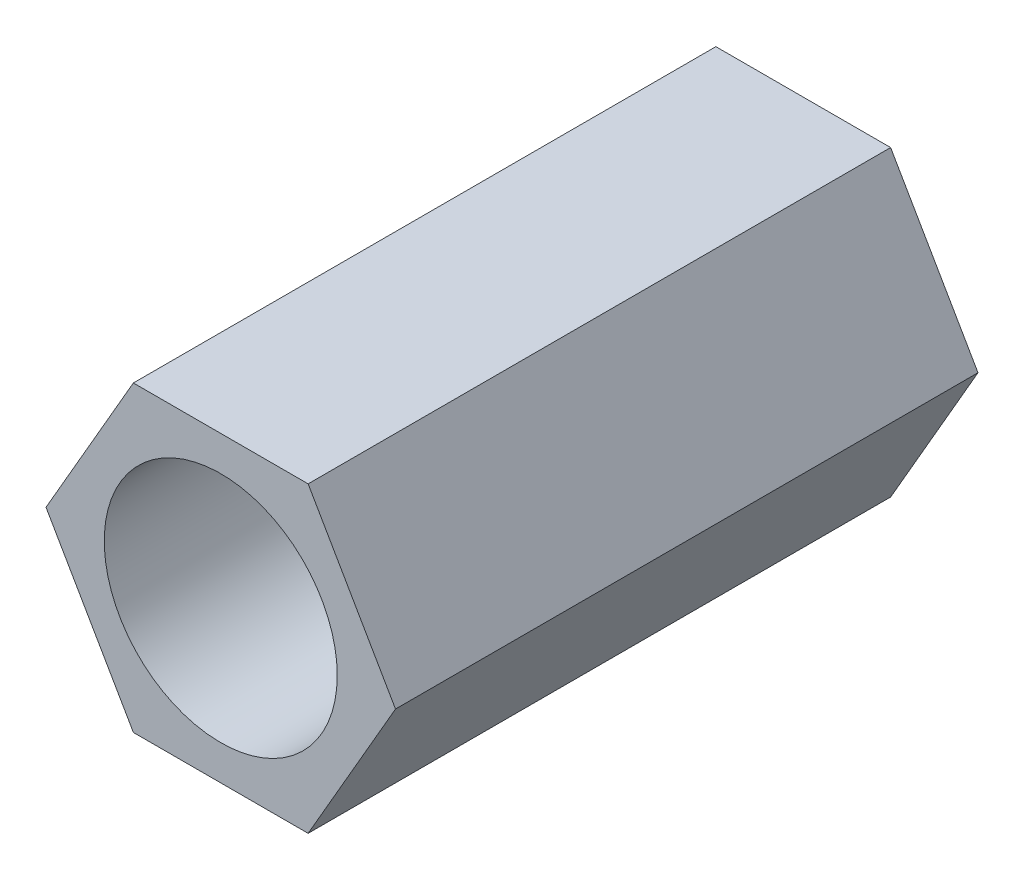
ISO-10303-21;
HEADER;
FILE_DESCRIPTION(('STEP AP214'),'2;1');
FILE_NAME('part.step','',(''),(''),'','','');
FILE_SCHEMA(('AUTOMOTIVE_DESIGN { 1 0 10303 214 1 1 1 1 }'));
ENDSEC;
DATA;
#1=APPLICATION_CONTEXT('core data for automotive mechanical design processes');
#2=APPLICATION_PROTOCOL_DEFINITION('international standard','automotive_design',2000,#1);
#3=PRODUCT_CONTEXT('',#1,'mechanical');
#4=PRODUCT('Part','Part','',(#3));
#5=PRODUCT_RELATED_PRODUCT_CATEGORY('part','',(#4));
#6=PRODUCT_DEFINITION_FORMATION('','',#4);
#7=PRODUCT_DEFINITION_CONTEXT('part definition',#1,'design');
#8=PRODUCT_DEFINITION('design','',#6,#7);
#9=PRODUCT_DEFINITION_SHAPE('','',#8);
#10=(LENGTH_UNIT() NAMED_UNIT(*) SI_UNIT(.MILLI.,.METRE.));
#11=(NAMED_UNIT(*) PLANE_ANGLE_UNIT() SI_UNIT($,.RADIAN.));
#12=(NAMED_UNIT(*) SI_UNIT($,.STERADIAN.) SOLID_ANGLE_UNIT());
#13=UNCERTAINTY_MEASURE_WITH_UNIT(LENGTH_MEASURE(1.E-05),#10,'distance_accuracy_value','');
#14=(GEOMETRIC_REPRESENTATION_CONTEXT(3) GLOBAL_UNCERTAINTY_ASSIGNED_CONTEXT((#13)) GLOBAL_UNIT_ASSIGNED_CONTEXT((#10,
#11,#12)) REPRESENTATION_CONTEXT('',''));
#15=CARTESIAN_POINT('',(0.,0.,0.));
#16=DIRECTION('',(0.,0.,1.));
#17=DIRECTION('',(1.,0.,0.));
#18=AXIS2_PLACEMENT_3D('',#15,#16,#17);
#19=CARTESIAN_POINT('',(0.,0.,10.));
#20=DIRECTION('',(0.,0.,1.));
#21=DIRECTION('',(1.,0.,0.));
#22=AXIS2_PLACEMENT_3D('',#19,#20,#21);
#23=PLANE('',#22);
#24=DIRECTION('',(-0.5,-0.866025403784439,0.));
#25=VECTOR('',#24,1.);
#26=CARTESIAN_POINT('',(-1.5,2.59807621135332,10.));
#27=LINE('',#26,#25);
#28=CARTESIAN_POINT('',(-1.5,2.59807621135332,10.));
#29=VERTEX_POINT('',#28);
#30=CARTESIAN_POINT('',(-3.,0.,10.));
#31=VERTEX_POINT('',#30);
#32=EDGE_CURVE('E146',#29,#31,#27,.T.);
#33=ORIENTED_EDGE('',*,*,#32,.T.);
#34=DIRECTION('',(0.5,-0.866025403784439,0.));
#35=VECTOR('',#34,1.);
#36=CARTESIAN_POINT('',(-3.,0.,10.));
#37=LINE('',#36,#35);
#38=CARTESIAN_POINT('',(-1.5,-2.59807621135332,10.));
#39=VERTEX_POINT('',#38);
#40=EDGE_CURVE('E94',#31,#39,#37,.T.);
#41=ORIENTED_EDGE('',*,*,#40,.T.);
#42=DIRECTION('',(1.,0.,0.));
#43=VECTOR('',#42,1.);
#44=CARTESIAN_POINT('',(-1.5,-2.59807621135332,10.));
#45=LINE('',#44,#43);
#46=CARTESIAN_POINT('',(1.5,-2.59807621135332,10.));
#47=VERTEX_POINT('',#46);
#48=EDGE_CURVE('E107',#39,#47,#45,.T.);
#49=ORIENTED_EDGE('',*,*,#48,.T.);
#50=DIRECTION('',(0.5,0.866025403784439,0.));
#51=VECTOR('',#50,1.);
#52=CARTESIAN_POINT('',(1.5,-2.59807621135332,10.));
#53=LINE('',#52,#51);
#54=CARTESIAN_POINT('',(3.,0.,10.));
#55=VERTEX_POINT('',#54);
#56=EDGE_CURVE('E101',#47,#55,#53,.T.);
#57=ORIENTED_EDGE('',*,*,#56,.T.);
#58=DIRECTION('',(-0.5,0.866025403784439,0.));
#59=VECTOR('',#58,1.);
#60=CARTESIAN_POINT('',(3.,0.,10.));
#61=LINE('',#60,#59);
#62=CARTESIAN_POINT('',(1.5,2.59807621135332,10.));
#63=VERTEX_POINT('',#62);
#64=EDGE_CURVE('E105',#55,#63,#61,.T.);
#65=ORIENTED_EDGE('',*,*,#64,.T.);
#66=DIRECTION('',(-1.,0.,0.));
#67=VECTOR('',#66,1.);
#68=CARTESIAN_POINT('',(1.5,2.59807621135332,10.));
#69=LINE('',#68,#67);
#70=EDGE_CURVE('E57',#63,#29,#69,.T.);
#71=ORIENTED_EDGE('',*,*,#70,.T.);
#72=EDGE_LOOP('',(#33,#41,#49,#57,#65,#71));
#73=FACE_BOUND('',#72,.T.);
#74=CARTESIAN_POINT('',(0.,0.,10.));
#75=DIRECTION('',(0.,0.,1.));
#76=DIRECTION('',(1.,0.,0.));
#77=AXIS2_PLACEMENT_3D('',#74,#75,#76);
#78=CIRCLE('',#77,2.);
#79=CARTESIAN_POINT('',(2.,0.,10.));
#80=VERTEX_POINT('',#79);
#81=EDGE_CURVE('E134',#80,#80,#78,.T.);
#82=ORIENTED_EDGE('',*,*,#81,.F.);
#83=EDGE_LOOP('',(#82));
#84=FACE_BOUND('',#83,.T.);
#85=ADVANCED_FACE('F39',(#73,#84),#23,.T.);
#86=CARTESIAN_POINT('',(0.,0.,0.));
#87=DIRECTION('',(0.,0.,1.));
#88=DIRECTION('',(1.,0.,0.));
#89=AXIS2_PLACEMENT_3D('',#86,#87,#88);
#90=PLANE('',#89);
#91=DIRECTION('',(-0.5,-0.866025403784439,0.));
#92=VECTOR('',#91,1.);
#93=CARTESIAN_POINT('',(-1.5,2.59807621135332,0.));
#94=LINE('',#93,#92);
#95=CARTESIAN_POINT('',(-1.5,2.59807621135332,0.));
#96=VERTEX_POINT('',#95);
#97=CARTESIAN_POINT('',(-3.,0.,0.));
#98=VERTEX_POINT('',#97);
#99=EDGE_CURVE('E129',#96,#98,#94,.T.);
#100=ORIENTED_EDGE('',*,*,#99,.F.);
#101=DIRECTION('',(-1.,0.,0.));
#102=VECTOR('',#101,1.);
#103=CARTESIAN_POINT('',(1.5,2.59807621135332,0.));
#104=LINE('',#103,#102);
#105=CARTESIAN_POINT('',(1.5,2.59807621135332,0.));
#106=VERTEX_POINT('',#105);
#107=EDGE_CURVE('E86',#106,#96,#104,.T.);
#108=ORIENTED_EDGE('',*,*,#107,.F.);
#109=DIRECTION('',(-0.5,0.866025403784439,0.));
#110=VECTOR('',#109,1.);
#111=CARTESIAN_POINT('',(3.,0.,0.));
#112=LINE('',#111,#110);
#113=CARTESIAN_POINT('',(3.,0.,0.));
#114=VERTEX_POINT('',#113);
#115=EDGE_CURVE('E80',#114,#106,#112,.T.);
#116=ORIENTED_EDGE('',*,*,#115,.F.);
#117=DIRECTION('',(0.5,0.866025403784439,0.));
#118=VECTOR('',#117,1.);
#119=CARTESIAN_POINT('',(1.5,-2.59807621135332,0.));
#120=LINE('',#119,#118);
#121=CARTESIAN_POINT('',(1.5,-2.59807621135332,0.));
#122=VERTEX_POINT('',#121);
#123=EDGE_CURVE('E116',#122,#114,#120,.T.);
#124=ORIENTED_EDGE('',*,*,#123,.F.);
#125=DIRECTION('',(1.,0.,0.));
#126=VECTOR('',#125,1.);
#127=CARTESIAN_POINT('',(-1.5,-2.59807621135332,0.));
#128=LINE('',#127,#126);
#129=CARTESIAN_POINT('',(-1.5,-2.59807621135332,0.));
#130=VERTEX_POINT('',#129);
#131=EDGE_CURVE('E137',#130,#122,#128,.T.);
#132=ORIENTED_EDGE('',*,*,#131,.F.);
#133=DIRECTION('',(0.5,-0.866025403784439,0.));
#134=VECTOR('',#133,1.);
#135=CARTESIAN_POINT('',(-3.,0.,0.));
#136=LINE('',#135,#134);
#137=EDGE_CURVE('E133',#98,#130,#136,.T.);
#138=ORIENTED_EDGE('',*,*,#137,.F.);
#139=EDGE_LOOP('',(#100,#108,#116,#124,#132,#138));
#140=FACE_BOUND('',#139,.T.);
#141=CARTESIAN_POINT('',(0.,0.,0.));
#142=DIRECTION('',(0.,0.,1.));
#143=DIRECTION('',(1.,0.,0.));
#144=AXIS2_PLACEMENT_3D('',#141,#142,#143);
#145=CIRCLE('',#144,2.);
#146=CARTESIAN_POINT('',(2.,0.,0.));
#147=VERTEX_POINT('',#146);
#148=EDGE_CURVE('E243',#147,#147,#145,.T.);
#149=ORIENTED_EDGE('',*,*,#148,.T.);
#150=EDGE_LOOP('',(#149));
#151=FACE_BOUND('',#150,.T.);
#152=ADVANCED_FACE('F159',(#140,#151),#90,.F.);
#153=CARTESIAN_POINT('',(-1.5,2.59807621135332,10.));
#154=DIRECTION('',(0.866025403784439,-0.5,0.));
#155=DIRECTION('',(0.5,0.866025403784439,0.));
#156=AXIS2_PLACEMENT_3D('',#153,#154,#155);
#157=PLANE('',#156);
#158=ORIENTED_EDGE('',*,*,#99,.T.);
#159=DIRECTION('',(0.,0.,-1.));
#160=VECTOR('',#159,1.);
#161=CARTESIAN_POINT('',(-3.,0.,10.));
#162=LINE('',#161,#160);
#163=EDGE_CURVE('E11',#31,#98,#162,.T.);
#164=ORIENTED_EDGE('',*,*,#163,.F.);
#165=ORIENTED_EDGE('',*,*,#32,.F.);
#166=DIRECTION('',(0.,0.,-1.));
#167=VECTOR('',#166,1.);
#168=CARTESIAN_POINT('',(-1.5,2.59807621135332,10.));
#169=LINE('',#168,#167);
#170=EDGE_CURVE('E125',#29,#96,#169,.T.);
#171=ORIENTED_EDGE('',*,*,#170,.T.);
#172=EDGE_LOOP('',(#158,#164,#165,#171));
#173=FACE_BOUND('',#172,.T.);
#174=ADVANCED_FACE('F41',(#173),#157,.F.);
#175=CARTESIAN_POINT('',(-3.,0.,10.));
#176=DIRECTION('',(0.866025403784439,0.5,0.));
#177=DIRECTION('',(-0.5,0.866025403784439,0.));
#178=AXIS2_PLACEMENT_3D('',#175,#176,#177);
#179=PLANE('',#178);
#180=ORIENTED_EDGE('',*,*,#137,.T.);
#181=DIRECTION('',(0.,0.,-1.));
#182=VECTOR('',#181,1.);
#183=CARTESIAN_POINT('',(-1.5,-2.59807621135332,10.));
#184=LINE('',#183,#182);
#185=EDGE_CURVE('E49',#39,#130,#184,.T.);
#186=ORIENTED_EDGE('',*,*,#185,.F.);
#187=ORIENTED_EDGE('',*,*,#40,.F.);
#188=ORIENTED_EDGE('',*,*,#163,.T.);
#189=EDGE_LOOP('',(#180,#186,#187,#188));
#190=FACE_BOUND('',#189,.T.);
#191=ADVANCED_FACE('F184',(#190),#179,.F.);
#192=CARTESIAN_POINT('',(-1.5,-2.59807621135332,10.));
#193=DIRECTION('',(0.,1.,0.));
#194=DIRECTION('',(-1.,0.,0.));
#195=AXIS2_PLACEMENT_3D('',#192,#193,#194);
#196=PLANE('',#195);
#197=ORIENTED_EDGE('',*,*,#131,.T.);
#198=DIRECTION('',(0.,0.,-1.));
#199=VECTOR('',#198,1.);
#200=CARTESIAN_POINT('',(1.5,-2.59807621135332,10.));
#201=LINE('',#200,#199);
#202=EDGE_CURVE('E118',#47,#122,#201,.T.);
#203=ORIENTED_EDGE('',*,*,#202,.F.);
#204=ORIENTED_EDGE('',*,*,#48,.F.);
#205=ORIENTED_EDGE('',*,*,#185,.T.);
#206=EDGE_LOOP('',(#197,#203,#204,#205));
#207=FACE_BOUND('',#206,.T.);
#208=ADVANCED_FACE('F156',(#207),#196,.F.);
#209=CARTESIAN_POINT('',(1.5,-2.59807621135332,10.));
#210=DIRECTION('',(-0.866025403784439,0.5,0.));
#211=DIRECTION('',(-0.5,-0.866025403784439,0.));
#212=AXIS2_PLACEMENT_3D('',#209,#210,#211);
#213=PLANE('',#212);
#214=ORIENTED_EDGE('',*,*,#123,.T.);
#215=DIRECTION('',(0.,0.,-1.));
#216=VECTOR('',#215,1.);
#217=CARTESIAN_POINT('',(3.,0.,10.));
#218=LINE('',#217,#216);
#219=EDGE_CURVE('E113',#55,#114,#218,.T.);
#220=ORIENTED_EDGE('',*,*,#219,.F.);
#221=ORIENTED_EDGE('',*,*,#56,.F.);
#222=ORIENTED_EDGE('',*,*,#202,.T.);
#223=EDGE_LOOP('',(#214,#220,#221,#222));
#224=FACE_BOUND('',#223,.T.);
#225=ADVANCED_FACE('F114',(#224),#213,.F.);
#226=CARTESIAN_POINT('',(3.,0.,10.));
#227=DIRECTION('',(-0.866025403784439,-0.5,0.));
#228=DIRECTION('',(0.5,-0.866025403784439,0.));
#229=AXIS2_PLACEMENT_3D('',#226,#227,#228);
#230=PLANE('',#229);
#231=ORIENTED_EDGE('',*,*,#115,.T.);
#232=DIRECTION('',(0.,0.,-1.));
#233=VECTOR('',#232,1.);
#234=CARTESIAN_POINT('',(1.5,2.59807621135332,10.));
#235=LINE('',#234,#233);
#236=EDGE_CURVE('E119',#63,#106,#235,.T.);
#237=ORIENTED_EDGE('',*,*,#236,.F.);
#238=ORIENTED_EDGE('',*,*,#64,.F.);
#239=ORIENTED_EDGE('',*,*,#219,.T.);
#240=EDGE_LOOP('',(#231,#237,#238,#239));
#241=FACE_BOUND('',#240,.T.);
#242=ADVANCED_FACE('F121',(#241),#230,.F.);
#243=CARTESIAN_POINT('',(1.5,2.59807621135332,10.));
#244=DIRECTION('',(0.,-1.,0.));
#245=DIRECTION('',(0.,0.,-1.));
#246=AXIS2_PLACEMENT_3D('',#243,#244,#245);
#247=PLANE('',#246);
#248=ORIENTED_EDGE('',*,*,#107,.T.);
#249=ORIENTED_EDGE('',*,*,#170,.F.);
#250=ORIENTED_EDGE('',*,*,#70,.F.);
#251=ORIENTED_EDGE('',*,*,#236,.T.);
#252=EDGE_LOOP('',(#248,#249,#250,#251));
#253=FACE_BOUND('',#252,.T.);
#254=ADVANCED_FACE('F164',(#253),#247,.F.);
#255=CARTESIAN_POINT('',(0.,0.,10.));
#256=DIRECTION('',(0.,0.,-1.));
#257=DIRECTION('',(-1.,0.,0.));
#258=AXIS2_PLACEMENT_3D('',#255,#256,#257);
#259=CYLINDRICAL_SURFACE('',#258,2.);
#260=ORIENTED_EDGE('',*,*,#81,.T.);
#261=EDGE_LOOP('',(#260));
#262=FACE_BOUND('',#261,.T.);
#263=ORIENTED_EDGE('',*,*,#148,.F.);
#264=EDGE_LOOP('',(#263));
#265=FACE_BOUND('',#264,.T.);
#266=ADVANCED_FACE('F166',(#262,#265),#259,.F.);
#267=CLOSED_SHELL('',(#85,#152,#174,#191,#208,#225,#242,#254,#266));
#268=MANIFOLD_SOLID_BREP('B2',#267);
#269=ADVANCED_BREP_SHAPE_REPRESENTATION('',(#18,#268),#14);
#270=SHAPE_DEFINITION_REPRESENTATION(#9,#269);
ENDSEC;
END-ISO-10303-21;
